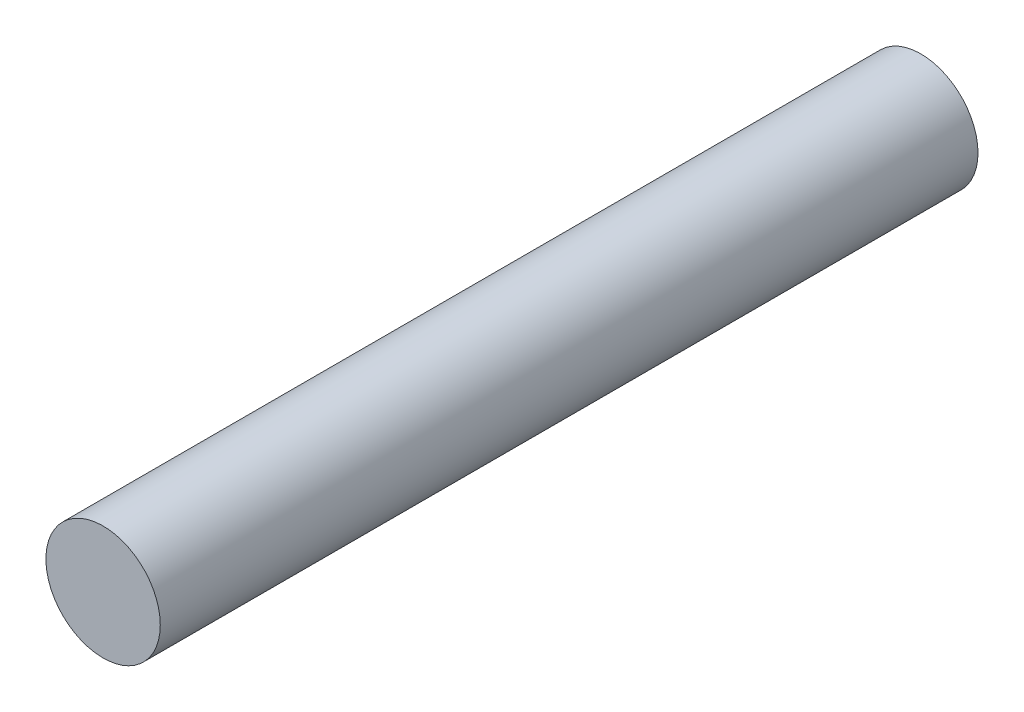
ISO-10303-21;
HEADER;
FILE_DESCRIPTION(('STEP AP214'),'2;1');
FILE_NAME('part.step','',(''),(''),'','','');
FILE_SCHEMA(('AUTOMOTIVE_DESIGN { 1 0 10303 214 1 1 1 1 }'));
ENDSEC;
DATA;
#1=APPLICATION_CONTEXT('core data for automotive mechanical design processes');
#2=APPLICATION_PROTOCOL_DEFINITION('international standard','automotive_design',2000,#1);
#3=PRODUCT_CONTEXT('',#1,'mechanical');
#4=PRODUCT('Part','Part','',(#3));
#5=PRODUCT_RELATED_PRODUCT_CATEGORY('part','',(#4));
#6=PRODUCT_DEFINITION_FORMATION('','',#4);
#7=PRODUCT_DEFINITION_CONTEXT('part definition',#1,'design');
#8=PRODUCT_DEFINITION('design','',#6,#7);
#9=PRODUCT_DEFINITION_SHAPE('','',#8);
#10=(LENGTH_UNIT() NAMED_UNIT(*) SI_UNIT(.MILLI.,.METRE.));
#11=(NAMED_UNIT(*) PLANE_ANGLE_UNIT() SI_UNIT($,.RADIAN.));
#12=(NAMED_UNIT(*) SI_UNIT($,.STERADIAN.) SOLID_ANGLE_UNIT());
#13=UNCERTAINTY_MEASURE_WITH_UNIT(LENGTH_MEASURE(1.E-05),#10,'distance_accuracy_value','');
#14=(GEOMETRIC_REPRESENTATION_CONTEXT(3) GLOBAL_UNCERTAINTY_ASSIGNED_CONTEXT((#13)) GLOBAL_UNIT_ASSIGNED_CONTEXT((#10,
#11,#12)) REPRESENTATION_CONTEXT('',''));
#15=CARTESIAN_POINT('',(0.,0.,0.));
#16=DIRECTION('',(0.,0.,1.));
#17=DIRECTION('',(1.,0.,0.));
#18=AXIS2_PLACEMENT_3D('',#15,#16,#17);
#19=CARTESIAN_POINT('',(0.,0.,45.3946));
#20=DIRECTION('',(0.,0.,-1.));
#21=DIRECTION('',(-1.,0.,0.));
#22=AXIS2_PLACEMENT_3D('',#19,#20,#21);
#23=CYLINDRICAL_SURFACE('',#22,3.175);
#24=CARTESIAN_POINT('',(0.,0.,45.3946));
#25=DIRECTION('',(0.,0.,1.));
#26=DIRECTION('',(1.,0.,0.));
#27=AXIS2_PLACEMENT_3D('',#24,#25,#26);
#28=CIRCLE('',#27,3.175);
#29=CARTESIAN_POINT('',(3.175,0.,45.3946));
#30=VERTEX_POINT('',#29);
#31=EDGE_CURVE('E10',#30,#30,#28,.T.);
#32=ORIENTED_EDGE('',*,*,#31,.F.);
#33=EDGE_LOOP('',(#32));
#34=FACE_BOUND('',#33,.T.);
#35=CARTESIAN_POINT('',(0.,0.,0.));
#36=DIRECTION('',(0.,0.,1.));
#37=DIRECTION('',(1.,0.,0.));
#38=AXIS2_PLACEMENT_3D('',#35,#36,#37);
#39=CIRCLE('',#38,3.175);
#40=CARTESIAN_POINT('',(3.175,0.,0.));
#41=VERTEX_POINT('',#40);
#42=EDGE_CURVE('E44',#41,#41,#39,.T.);
#43=ORIENTED_EDGE('',*,*,#42,.T.);
#44=EDGE_LOOP('',(#43));
#45=FACE_BOUND('',#44,.T.);
#46=ADVANCED_FACE('F41',(#34,#45),#23,.T.);
#47=CARTESIAN_POINT('',(0.,0.,45.3946));
#48=DIRECTION('',(0.,0.,1.));
#49=DIRECTION('',(1.,0.,0.));
#50=AXIS2_PLACEMENT_3D('',#47,#48,#49);
#51=PLANE('',#50);
#52=ORIENTED_EDGE('',*,*,#31,.T.);
#53=EDGE_LOOP('',(#52));
#54=FACE_BOUND('',#53,.T.);
#55=ADVANCED_FACE('F58',(#54),#51,.T.);
#56=CARTESIAN_POINT('',(0.,0.,0.));
#57=DIRECTION('',(0.,0.,1.));
#58=DIRECTION('',(1.,0.,0.));
#59=AXIS2_PLACEMENT_3D('',#56,#57,#58);
#60=PLANE('',#59);
#61=ORIENTED_EDGE('',*,*,#42,.F.);
#62=EDGE_LOOP('',(#61));
#63=FACE_BOUND('',#62,.T.);
#64=ADVANCED_FACE('F56',(#63),#60,.F.);
#65=CLOSED_SHELL('',(#46,#55,#64));
#66=MANIFOLD_SOLID_BREP('B2',#65);
#67=ADVANCED_BREP_SHAPE_REPRESENTATION('',(#18,#66),#14);
#68=SHAPE_DEFINITION_REPRESENTATION(#9,#67);
ENDSEC;
END-ISO-10303-21;
